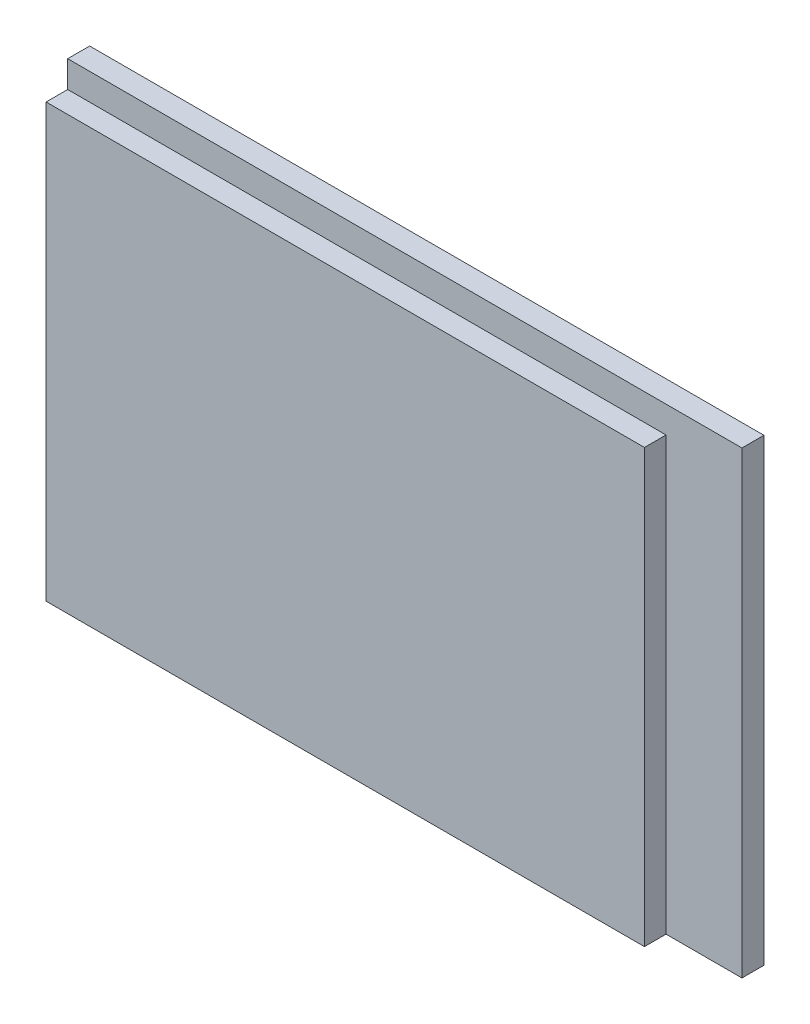
ISO-10303-21;
HEADER;
FILE_DESCRIPTION(('STEP AP214'),'2;1');
FILE_NAME('part.step','',(''),(''),'','','');
FILE_SCHEMA(('AUTOMOTIVE_DESIGN { 1 0 10303 214 1 1 1 1 }'));
ENDSEC;
DATA;
#1=APPLICATION_CONTEXT('core data for automotive mechanical design processes');
#2=APPLICATION_PROTOCOL_DEFINITION('international standard','automotive_design',2000,#1);
#3=PRODUCT_CONTEXT('',#1,'mechanical');
#4=PRODUCT('Part','Part','',(#3));
#5=PRODUCT_RELATED_PRODUCT_CATEGORY('part','',(#4));
#6=PRODUCT_DEFINITION_FORMATION('','',#4);
#7=PRODUCT_DEFINITION_CONTEXT('part definition',#1,'design');
#8=PRODUCT_DEFINITION('design','',#6,#7);
#9=PRODUCT_DEFINITION_SHAPE('','',#8);
#10=(LENGTH_UNIT() NAMED_UNIT(*) SI_UNIT(.MILLI.,.METRE.));
#11=(NAMED_UNIT(*) PLANE_ANGLE_UNIT() SI_UNIT($,.RADIAN.));
#12=(NAMED_UNIT(*) SI_UNIT($,.STERADIAN.) SOLID_ANGLE_UNIT());
#13=UNCERTAINTY_MEASURE_WITH_UNIT(LENGTH_MEASURE(1.E-05),#10,'distance_accuracy_value','');
#14=(GEOMETRIC_REPRESENTATION_CONTEXT(3) GLOBAL_UNCERTAINTY_ASSIGNED_CONTEXT((#13)) GLOBAL_UNIT_ASSIGNED_CONTEXT((#10,
#11,#12)) REPRESENTATION_CONTEXT('',''));
#15=CARTESIAN_POINT('',(0.,0.,0.));
#16=DIRECTION('',(0.,0.,1.));
#17=DIRECTION('',(1.,0.,0.));
#18=AXIS2_PLACEMENT_3D('',#15,#16,#17);
#19=CARTESIAN_POINT('',(0.,0.,2.54));
#20=DIRECTION('',(0.,0.,-1.));
#21=DIRECTION('',(-1.,0.,0.));
#22=AXIS2_PLACEMENT_3D('',#19,#20,#21);
#23=PLANE('',#22);
#24=DIRECTION('',(-1.,0.,0.));
#25=VECTOR('',#24,1.);
#26=CARTESIAN_POINT('',(-38.989,23.457,2.54));
#27=LINE('',#26,#25);
#28=CARTESIAN_POINT('',(30.211,23.457,2.54));
#29=VERTEX_POINT('',#28);
#30=CARTESIAN_POINT('',(-38.989,23.457,2.54));
#31=VERTEX_POINT('',#30);
#32=EDGE_CURVE('E127',#29,#31,#27,.T.);
#33=ORIENTED_EDGE('',*,*,#32,.F.);
#34=DIRECTION('',(0.,1.,0.));
#35=VECTOR('',#34,1.);
#36=CARTESIAN_POINT('',(30.211,-26.543,2.54));
#37=LINE('',#36,#35);
#38=CARTESIAN_POINT('',(30.211,-26.543,2.54));
#39=VERTEX_POINT('',#38);
#40=EDGE_CURVE('E55',#39,#29,#37,.T.);
#41=ORIENTED_EDGE('',*,*,#40,.F.);
#42=DIRECTION('',(1.,0.,0.));
#43=VECTOR('',#42,1.);
#44=CARTESIAN_POINT('',(-38.989,-26.543,2.54));
#45=LINE('',#44,#43);
#46=CARTESIAN_POINT('',(38.989,-26.543,2.54));
#47=VERTEX_POINT('',#46);
#48=EDGE_CURVE('E158',#39,#47,#45,.T.);
#49=ORIENTED_EDGE('',*,*,#48,.T.);
#50=DIRECTION('',(0.,1.,0.));
#51=VECTOR('',#50,1.);
#52=CARTESIAN_POINT('',(38.989,-26.543,2.54));
#53=LINE('',#52,#51);
#54=CARTESIAN_POINT('',(38.989,26.543,2.54));
#55=VERTEX_POINT('',#54);
#56=EDGE_CURVE('E148',#47,#55,#53,.T.);
#57=ORIENTED_EDGE('',*,*,#56,.T.);
#58=DIRECTION('',(-1.,0.,0.));
#59=VECTOR('',#58,1.);
#60=CARTESIAN_POINT('',(-38.989,26.543,2.54));
#61=LINE('',#60,#59);
#62=CARTESIAN_POINT('',(-38.989,26.543,2.54));
#63=VERTEX_POINT('',#62);
#64=EDGE_CURVE('E152',#55,#63,#61,.T.);
#65=ORIENTED_EDGE('',*,*,#64,.T.);
#66=DIRECTION('',(0.,-1.,0.));
#67=VECTOR('',#66,1.);
#68=CARTESIAN_POINT('',(-38.989,-26.543,2.54));
#69=LINE('',#68,#67);
#70=EDGE_CURVE('E61',#63,#31,#69,.T.);
#71=ORIENTED_EDGE('',*,*,#70,.T.);
#72=EDGE_LOOP('',(#33,#41,#49,#57,#65,#71));
#73=FACE_BOUND('',#72,.T.);
#74=ADVANCED_FACE('F39',(#73),#23,.F.);
#75=CARTESIAN_POINT('',(38.989,-26.543,2.54));
#76=DIRECTION('',(-1.,0.,0.));
#77=DIRECTION('',(0.,0.,1.));
#78=AXIS2_PLACEMENT_3D('',#75,#76,#77);
#79=PLANE('',#78);
#80=DIRECTION('',(0.,1.,0.));
#81=VECTOR('',#80,1.);
#82=CARTESIAN_POINT('',(38.989,-26.543,0.));
#83=LINE('',#82,#81);
#84=CARTESIAN_POINT('',(38.989,-26.543,0.));
#85=VERTEX_POINT('',#84);
#86=CARTESIAN_POINT('',(38.989,26.543,0.));
#87=VERTEX_POINT('',#86);
#88=EDGE_CURVE('E147',#85,#87,#83,.T.);
#89=ORIENTED_EDGE('',*,*,#88,.T.);
#90=DIRECTION('',(0.,0.,-1.));
#91=VECTOR('',#90,1.);
#92=CARTESIAN_POINT('',(38.989,26.543,2.54));
#93=LINE('',#92,#91);
#94=EDGE_CURVE('E11',#55,#87,#93,.T.);
#95=ORIENTED_EDGE('',*,*,#94,.F.);
#96=ORIENTED_EDGE('',*,*,#56,.F.);
#97=DIRECTION('',(0.,0.,-1.));
#98=VECTOR('',#97,1.);
#99=CARTESIAN_POINT('',(38.989,-26.543,2.54));
#100=LINE('',#99,#98);
#101=EDGE_CURVE('E110',#47,#85,#100,.T.);
#102=ORIENTED_EDGE('',*,*,#101,.T.);
#103=EDGE_LOOP('',(#89,#95,#96,#102));
#104=FACE_BOUND('',#103,.T.);
#105=ADVANCED_FACE('F41',(#104),#79,.F.);
#106=CARTESIAN_POINT('',(-38.989,26.543,2.54));
#107=DIRECTION('',(0.,-1.,0.));
#108=DIRECTION('',(0.,0.,-1.));
#109=AXIS2_PLACEMENT_3D('',#106,#107,#108);
#110=PLANE('',#109);
#111=DIRECTION('',(-1.,0.,0.));
#112=VECTOR('',#111,1.);
#113=CARTESIAN_POINT('',(-38.989,26.543,0.));
#114=LINE('',#113,#112);
#115=CARTESIAN_POINT('',(-38.989,26.543,0.));
#116=VERTEX_POINT('',#115);
#117=EDGE_CURVE('E164',#87,#116,#114,.T.);
#118=ORIENTED_EDGE('',*,*,#117,.T.);
#119=DIRECTION('',(0.,0.,-1.));
#120=VECTOR('',#119,1.);
#121=CARTESIAN_POINT('',(-38.989,26.543,2.54));
#122=LINE('',#121,#120);
#123=EDGE_CURVE('E48',#63,#116,#122,.T.);
#124=ORIENTED_EDGE('',*,*,#123,.F.);
#125=ORIENTED_EDGE('',*,*,#64,.F.);
#126=ORIENTED_EDGE('',*,*,#94,.T.);
#127=EDGE_LOOP('',(#118,#124,#125,#126));
#128=FACE_BOUND('',#127,.T.);
#129=ADVANCED_FACE('F201',(#128),#110,.F.);
#130=CARTESIAN_POINT('',(-38.989,-26.543,2.54));
#131=DIRECTION('',(1.,0.,0.));
#132=DIRECTION('',(0.,0.,-1.));
#133=AXIS2_PLACEMENT_3D('',#130,#131,#132);
#134=PLANE('',#133);
#135=DIRECTION('',(0.,-1.,0.));
#136=VECTOR('',#135,1.);
#137=CARTESIAN_POINT('',(-38.989,-26.543,0.));
#138=LINE('',#137,#136);
#139=CARTESIAN_POINT('',(-38.989,-26.543,0.));
#140=VERTEX_POINT('',#139);
#141=EDGE_CURVE('E106',#116,#140,#138,.T.);
#142=ORIENTED_EDGE('',*,*,#141,.T.);
#143=DIRECTION('',(0.,0.,-1.));
#144=VECTOR('',#143,1.);
#145=CARTESIAN_POINT('',(-38.989,-26.543,2.54));
#146=LINE('',#145,#144);
#147=CARTESIAN_POINT('',(-38.989,-26.543,5.04));
#148=VERTEX_POINT('',#147);
#149=EDGE_CURVE('E98',#148,#140,#146,.T.);
#150=ORIENTED_EDGE('',*,*,#149,.F.);
#151=DIRECTION('',(0.,-1.,0.));
#152=VECTOR('',#151,1.);
#153=CARTESIAN_POINT('',(-38.989,-26.543,5.04));
#154=LINE('',#153,#152);
#155=CARTESIAN_POINT('',(-38.989,23.457,5.04));
#156=VERTEX_POINT('',#155);
#157=EDGE_CURVE('E103',#156,#148,#154,.T.);
#158=ORIENTED_EDGE('',*,*,#157,.F.);
#159=DIRECTION('',(0.,0.,-1.));
#160=VECTOR('',#159,1.);
#161=CARTESIAN_POINT('',(-38.989,23.457,5.04));
#162=LINE('',#161,#160);
#163=EDGE_CURVE('E136',#156,#31,#162,.T.);
#164=ORIENTED_EDGE('',*,*,#163,.T.);
#165=ORIENTED_EDGE('',*,*,#70,.F.);
#166=ORIENTED_EDGE('',*,*,#123,.T.);
#167=EDGE_LOOP('',(#142,#150,#158,#164,#165,#166));
#168=FACE_BOUND('',#167,.T.);
#169=ADVANCED_FACE('F100',(#168),#134,.F.);
#170=CARTESIAN_POINT('',(-38.989,-26.543,2.54));
#171=DIRECTION('',(0.,1.,0.));
#172=DIRECTION('',(0.,0.,1.));
#173=AXIS2_PLACEMENT_3D('',#170,#171,#172);
#174=PLANE('',#173);
#175=DIRECTION('',(1.,0.,0.));
#176=VECTOR('',#175,1.);
#177=CARTESIAN_POINT('',(-38.989,-26.543,0.));
#178=LINE('',#177,#176);
#179=EDGE_CURVE('E153',#140,#85,#178,.T.);
#180=ORIENTED_EDGE('',*,*,#179,.T.);
#181=ORIENTED_EDGE('',*,*,#101,.F.);
#182=ORIENTED_EDGE('',*,*,#48,.F.);
#183=DIRECTION('',(0.,0.,-1.));
#184=VECTOR('',#183,1.);
#185=CARTESIAN_POINT('',(30.211,-26.543,5.04));
#186=LINE('',#185,#184);
#187=CARTESIAN_POINT('',(30.211,-26.543,5.04));
#188=VERTEX_POINT('',#187);
#189=EDGE_CURVE('E116',#188,#39,#186,.T.);
#190=ORIENTED_EDGE('',*,*,#189,.F.);
#191=DIRECTION('',(1.,0.,0.));
#192=VECTOR('',#191,1.);
#193=CARTESIAN_POINT('',(-38.989,-26.543,5.04));
#194=LINE('',#193,#192);
#195=EDGE_CURVE('E113',#148,#188,#194,.T.);
#196=ORIENTED_EDGE('',*,*,#195,.F.);
#197=ORIENTED_EDGE('',*,*,#149,.T.);
#198=EDGE_LOOP('',(#180,#181,#182,#190,#196,#197));
#199=FACE_BOUND('',#198,.T.);
#200=ADVANCED_FACE('F114',(#199),#174,.F.);
#201=CARTESIAN_POINT('',(0.,0.,0.));
#202=DIRECTION('',(0.,0.,-1.));
#203=DIRECTION('',(-1.,0.,0.));
#204=AXIS2_PLACEMENT_3D('',#201,#202,#203);
#205=PLANE('',#204);
#206=ORIENTED_EDGE('',*,*,#88,.F.);
#207=ORIENTED_EDGE('',*,*,#179,.F.);
#208=ORIENTED_EDGE('',*,*,#141,.F.);
#209=ORIENTED_EDGE('',*,*,#117,.F.);
#210=EDGE_LOOP('',(#206,#207,#208,#209));
#211=FACE_BOUND('',#210,.T.);
#212=ADVANCED_FACE('F178',(#211),#205,.T.);
#213=CARTESIAN_POINT('',(30.211,-26.543,5.04));
#214=DIRECTION('',(-1.,0.,0.));
#215=DIRECTION('',(0.,0.,1.));
#216=AXIS2_PLACEMENT_3D('',#213,#214,#215);
#217=PLANE('',#216);
#218=ORIENTED_EDGE('',*,*,#40,.T.);
#219=DIRECTION('',(0.,0.,-1.));
#220=VECTOR('',#219,1.);
#221=CARTESIAN_POINT('',(30.211,23.457,5.04));
#222=LINE('',#221,#220);
#223=CARTESIAN_POINT('',(30.211,23.457,5.04));
#224=VERTEX_POINT('',#223);
#225=EDGE_CURVE('E141',#224,#29,#222,.T.);
#226=ORIENTED_EDGE('',*,*,#225,.F.);
#227=DIRECTION('',(0.,1.,0.));
#228=VECTOR('',#227,1.);
#229=CARTESIAN_POINT('',(30.211,-26.543,5.04));
#230=LINE('',#229,#228);
#231=EDGE_CURVE('E120',#188,#224,#230,.T.);
#232=ORIENTED_EDGE('',*,*,#231,.F.);
#233=ORIENTED_EDGE('',*,*,#189,.T.);
#234=EDGE_LOOP('',(#218,#226,#232,#233));
#235=FACE_BOUND('',#234,.T.);
#236=ADVANCED_FACE('F184',(#235),#217,.F.);
#237=CARTESIAN_POINT('',(-38.989,23.457,5.04));
#238=DIRECTION('',(0.,-1.,0.));
#239=DIRECTION('',(0.,0.,-1.));
#240=AXIS2_PLACEMENT_3D('',#237,#238,#239);
#241=PLANE('',#240);
#242=ORIENTED_EDGE('',*,*,#32,.T.);
#243=ORIENTED_EDGE('',*,*,#163,.F.);
#244=DIRECTION('',(-1.,0.,0.));
#245=VECTOR('',#244,1.);
#246=CARTESIAN_POINT('',(-38.989,23.457,5.04));
#247=LINE('',#246,#245);
#248=EDGE_CURVE('E124',#224,#156,#247,.T.);
#249=ORIENTED_EDGE('',*,*,#248,.F.);
#250=ORIENTED_EDGE('',*,*,#225,.T.);
#251=EDGE_LOOP('',(#242,#243,#249,#250));
#252=FACE_BOUND('',#251,.T.);
#253=ADVANCED_FACE('F187',(#252),#241,.F.);
#254=CARTESIAN_POINT('',(0.,0.,5.04));
#255=DIRECTION('',(0.,0.,-1.));
#256=DIRECTION('',(-1.,0.,0.));
#257=AXIS2_PLACEMENT_3D('',#254,#255,#256);
#258=PLANE('',#257);
#259=ORIENTED_EDGE('',*,*,#157,.T.);
#260=ORIENTED_EDGE('',*,*,#195,.T.);
#261=ORIENTED_EDGE('',*,*,#231,.T.);
#262=ORIENTED_EDGE('',*,*,#248,.T.);
#263=EDGE_LOOP('',(#259,#260,#261,#262));
#264=FACE_BOUND('',#263,.T.);
#265=ADVANCED_FACE('F122',(#264),#258,.F.);
#266=CLOSED_SHELL('',(#74,#105,#129,#169,#200,#212,#236,#253,#265));
#267=MANIFOLD_SOLID_BREP('B2',#266);
#268=ADVANCED_BREP_SHAPE_REPRESENTATION('',(#18,#267),#14);
#269=SHAPE_DEFINITION_REPRESENTATION(#9,#268);
ENDSEC;
END-ISO-10303-21;
